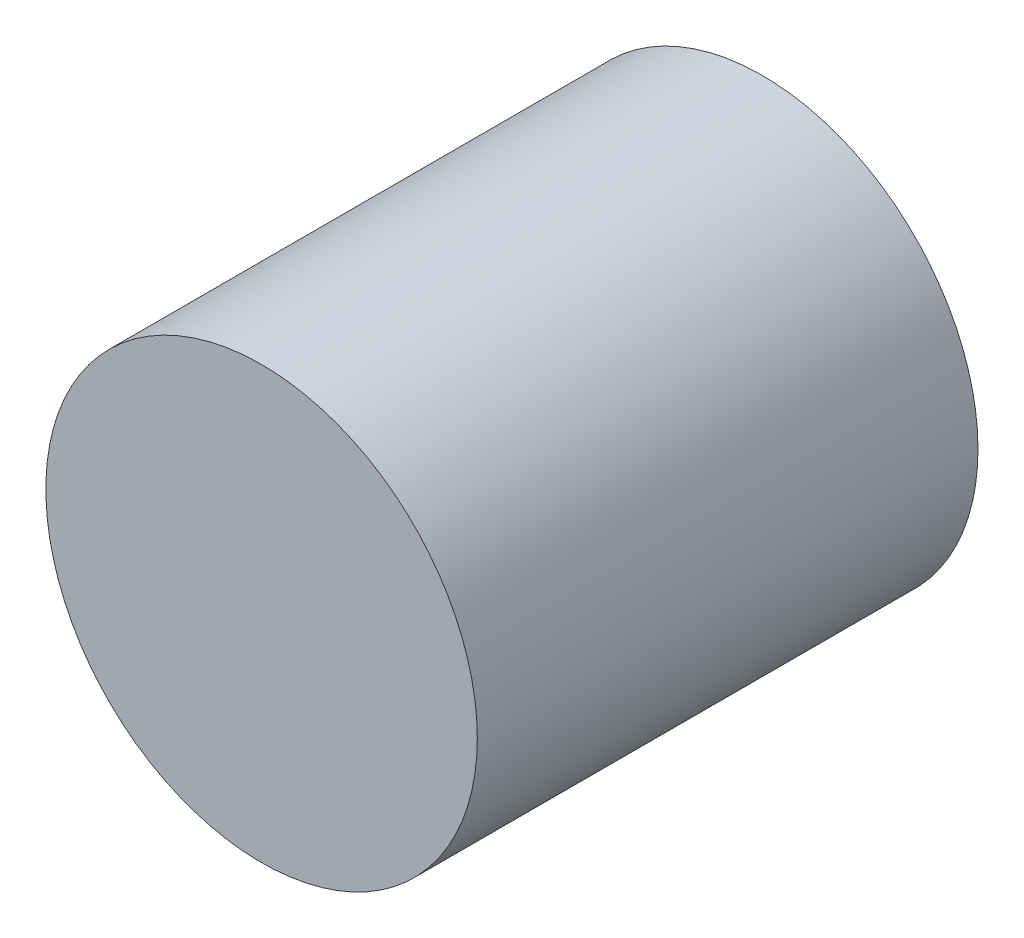
ISO-10303-21;
HEADER;
FILE_DESCRIPTION(('STEP AP214'),'2;1');
FILE_NAME('part.step','',(''),(''),'','','');
FILE_SCHEMA(('AUTOMOTIVE_DESIGN { 1 0 10303 214 1 1 1 1 }'));
ENDSEC;
DATA;
#1=APPLICATION_CONTEXT('core data for automotive mechanical design processes');
#2=APPLICATION_PROTOCOL_DEFINITION('international standard','automotive_design',2000,#1);
#3=PRODUCT_CONTEXT('',#1,'mechanical');
#4=PRODUCT('Part','Part','',(#3));
#5=PRODUCT_RELATED_PRODUCT_CATEGORY('part','',(#4));
#6=PRODUCT_DEFINITION_FORMATION('','',#4);
#7=PRODUCT_DEFINITION_CONTEXT('part definition',#1,'design');
#8=PRODUCT_DEFINITION('design','',#6,#7);
#9=PRODUCT_DEFINITION_SHAPE('','',#8);
#10=(LENGTH_UNIT() NAMED_UNIT(*) SI_UNIT(.MILLI.,.METRE.));
#11=(NAMED_UNIT(*) PLANE_ANGLE_UNIT() SI_UNIT($,.RADIAN.));
#12=(NAMED_UNIT(*) SI_UNIT($,.STERADIAN.) SOLID_ANGLE_UNIT());
#13=UNCERTAINTY_MEASURE_WITH_UNIT(LENGTH_MEASURE(1.E-05),#10,'distance_accuracy_value','');
#14=(GEOMETRIC_REPRESENTATION_CONTEXT(3) GLOBAL_UNCERTAINTY_ASSIGNED_CONTEXT((#13)) GLOBAL_UNIT_ASSIGNED_CONTEXT((#10,
#11,#12)) REPRESENTATION_CONTEXT('',''));
#15=CARTESIAN_POINT('',(0.,0.,0.));
#16=DIRECTION('',(0.,0.,1.));
#17=DIRECTION('',(1.,0.,0.));
#18=AXIS2_PLACEMENT_3D('',#15,#16,#17);
#19=CARTESIAN_POINT('',(0.,0.,70.));
#20=DIRECTION('',(0.,0.,-1.));
#21=DIRECTION('',(-1.,0.,0.));
#22=AXIS2_PLACEMENT_3D('',#19,#20,#21);
#23=CYLINDRICAL_SURFACE('',#22,30.1604229970987);
#24=CARTESIAN_POINT('',(0.,0.,70.));
#25=DIRECTION('',(0.,0.,1.));
#26=DIRECTION('',(1.,0.,0.));
#27=AXIS2_PLACEMENT_3D('',#24,#25,#26);
#28=CIRCLE('',#27,30.1604229970987);
#29=CARTESIAN_POINT('',(30.1604229970987,0.,70.));
#30=VERTEX_POINT('',#29);
#31=EDGE_CURVE('E11',#30,#30,#28,.T.);
#32=ORIENTED_EDGE('',*,*,#31,.F.);
#33=EDGE_LOOP('',(#32));
#34=FACE_BOUND('',#33,.T.);
#35=CARTESIAN_POINT('',(0.,0.,0.));
#36=DIRECTION('',(0.,0.,1.));
#37=DIRECTION('',(1.,0.,0.));
#38=AXIS2_PLACEMENT_3D('',#35,#36,#37);
#39=CIRCLE('',#38,30.1604229970987);
#40=CARTESIAN_POINT('',(30.1604229970987,0.,0.));
#41=VERTEX_POINT('',#40);
#42=EDGE_CURVE('E36',#41,#41,#39,.T.);
#43=ORIENTED_EDGE('',*,*,#42,.T.);
#44=EDGE_LOOP('',(#43));
#45=FACE_BOUND('',#44,.T.);
#46=ADVANCED_FACE('F33',(#34,#45),#23,.T.);
#47=CARTESIAN_POINT('',(0.,0.,70.));
#48=DIRECTION('',(0.,0.,1.));
#49=DIRECTION('',(1.,0.,0.));
#50=AXIS2_PLACEMENT_3D('',#47,#48,#49);
#51=PLANE('',#50);
#52=ORIENTED_EDGE('',*,*,#31,.T.);
#53=EDGE_LOOP('',(#52));
#54=FACE_BOUND('',#53,.T.);
#55=ADVANCED_FACE('F69',(#54),#51,.T.);
#56=CARTESIAN_POINT('',(0.,0.,0.));
#57=DIRECTION('',(0.,0.,1.));
#58=DIRECTION('',(1.,0.,0.));
#59=AXIS2_PLACEMENT_3D('',#56,#57,#58);
#60=PLANE('',#59);
#61=CARTESIAN_POINT('',(0.041525868770903,0.498310425250991,0.));
#62=DIRECTION('',(0.,0.,-1.));
#63=DIRECTION('',(-1.,0.,0.));
#64=AXIS2_PLACEMENT_3D('',#61,#62,#63);
#65=CIRCLE('',#64,16.031384);
#66=CARTESIAN_POINT('',(-15.9898581312291,0.498310425250991,0.));
#67=VERTEX_POINT('',#66);
#68=EDGE_CURVE('E61',#67,#67,#65,.T.);
#69=ORIENTED_EDGE('',*,*,#68,.F.);
#70=EDGE_LOOP('',(#69));
#71=FACE_BOUND('',#70,.T.);
#72=ORIENTED_EDGE('',*,*,#42,.F.);
#73=EDGE_LOOP('',(#72));
#74=FACE_BOUND('',#73,.T.);
#75=ADVANCED_FACE('F46',(#71,#74),#60,.F.);
#76=CARTESIAN_POINT('',(0.041525868770903,0.498310425250991,8.));
#77=DIRECTION('',(0.,0.,-1.));
#78=DIRECTION('',(-1.,0.,0.));
#79=AXIS2_PLACEMENT_3D('',#76,#77,#78);
#80=CONICAL_SURFACE('',#79,17.5005,1.02974425867665);
#81=CARTESIAN_POINT('',(0.0415258687709023,0.498310425250991,18.5153612632918));
#82=VERTEX_POINT('',#81);
#83=VERTEX_LOOP('',#82);
#84=FACE_BOUND('',#83,.T.);
#85=CARTESIAN_POINT('',(0.041525868770903,0.498310425250991,8.));
#86=DIRECTION('',(0.,0.,-1.));
#87=DIRECTION('',(-1.,0.,0.));
#88=AXIS2_PLACEMENT_3D('',#85,#86,#87);
#89=CIRCLE('',#88,17.5005);
#90=CARTESIAN_POINT('',(-17.4589741312291,0.498310425250991,8.));
#91=VERTEX_POINT('',#90);
#92=EDGE_CURVE('E50',#91,#91,#89,.T.);
#93=ORIENTED_EDGE('',*,*,#92,.T.);
#94=EDGE_LOOP('',(#93));
#95=FACE_BOUND('',#94,.T.);
#96=ADVANCED_FACE('F42',(#84,#95),#80,.F.);
#97=CARTESIAN_POINT('',(0.041525868770903,0.498310425250991,0.));
#98=DIRECTION('',(0.,0.,-1.));
#99=DIRECTION('',(-1.,0.,0.));
#100=AXIS2_PLACEMENT_3D('',#97,#98,#99);
#101=CYLINDRICAL_SURFACE('',#100,17.5005);
#102=ORIENTED_EDGE('',*,*,#92,.F.);
#103=EDGE_LOOP('',(#102));
#104=FACE_BOUND('',#103,.T.);
#105=CARTESIAN_POINT('',(0.041525868770903,0.498310425250991,0.1));
#106=DIRECTION('',(0.,0.,-1.));
#107=DIRECTION('',(-1.,0.,0.));
#108=AXIS2_PLACEMENT_3D('',#105,#106,#107);
#109=CIRCLE('',#108,17.5005);
#110=CARTESIAN_POINT('',(-17.4589741312291,0.498310425250991,0.1));
#111=VERTEX_POINT('',#110);
#112=EDGE_CURVE('E52',#111,#111,#109,.T.);
#113=ORIENTED_EDGE('',*,*,#112,.T.);
#114=EDGE_LOOP('',(#113));
#115=FACE_BOUND('',#114,.T.);
#116=ADVANCED_FACE('F45',(#104,#115),#101,.F.);
#117=CARTESIAN_POINT('',(17.5420258687709,0.498310425250991,0.1));
#118=DIRECTION('',(0.,0.,-1.));
#119=DIRECTION('',(-1.,0.,0.));
#120=AXIS2_PLACEMENT_3D('',#117,#118,#119);
#121=PLANE('',#120);
#122=ORIENTED_EDGE('',*,*,#112,.F.);
#123=EDGE_LOOP('',(#122));
#124=FACE_BOUND('',#123,.T.);
#125=CARTESIAN_POINT('',(0.041525868770903,0.498310425250991,0.1));
#126=DIRECTION('',(0.,0.,-1.));
#127=DIRECTION('',(-1.,0.,0.));
#128=AXIS2_PLACEMENT_3D('',#125,#126,#127);
#129=CIRCLE('',#128,16.0282623378935);
#130=CARTESIAN_POINT('',(-15.9867364691226,0.498310425250991,0.1));
#131=VERTEX_POINT('',#130);
#132=EDGE_CURVE('E56',#131,#131,#129,.T.);
#133=ORIENTED_EDGE('',*,*,#132,.T.);
#134=EDGE_LOOP('',(#133));
#135=FACE_BOUND('',#134,.T.);
#136=ADVANCED_FACE('F85',(#124,#135),#121,.F.);
#137=CARTESIAN_POINT('',(0.041525868770903,0.498310425250991,0.));
#138=DIRECTION('',(0.,0.,-1.));
#139=DIRECTION('',(-1.,0.,0.));
#140=AXIS2_PLACEMENT_3D('',#137,#138,#139);
#141=CONICAL_SURFACE('',#140,16.031384,0.0312064870256911);
#142=ORIENTED_EDGE('',*,*,#132,.F.);
#143=EDGE_LOOP('',(#142));
#144=FACE_BOUND('',#143,.T.);
#145=ORIENTED_EDGE('',*,*,#68,.T.);
#146=EDGE_LOOP('',(#145));
#147=FACE_BOUND('',#146,.T.);
#148=ADVANCED_FACE('F65',(#144,#147),#141,.F.);
#149=CLOSED_SHELL('',(#46,#55,#75,#96,#116,#136,#148));
#150=MANIFOLD_SOLID_BREP('B2',#149);
#151=ADVANCED_BREP_SHAPE_REPRESENTATION('',(#18,#150),#14);
#152=SHAPE_DEFINITION_REPRESENTATION(#9,#151);
ENDSEC;
END-ISO-10303-21;
